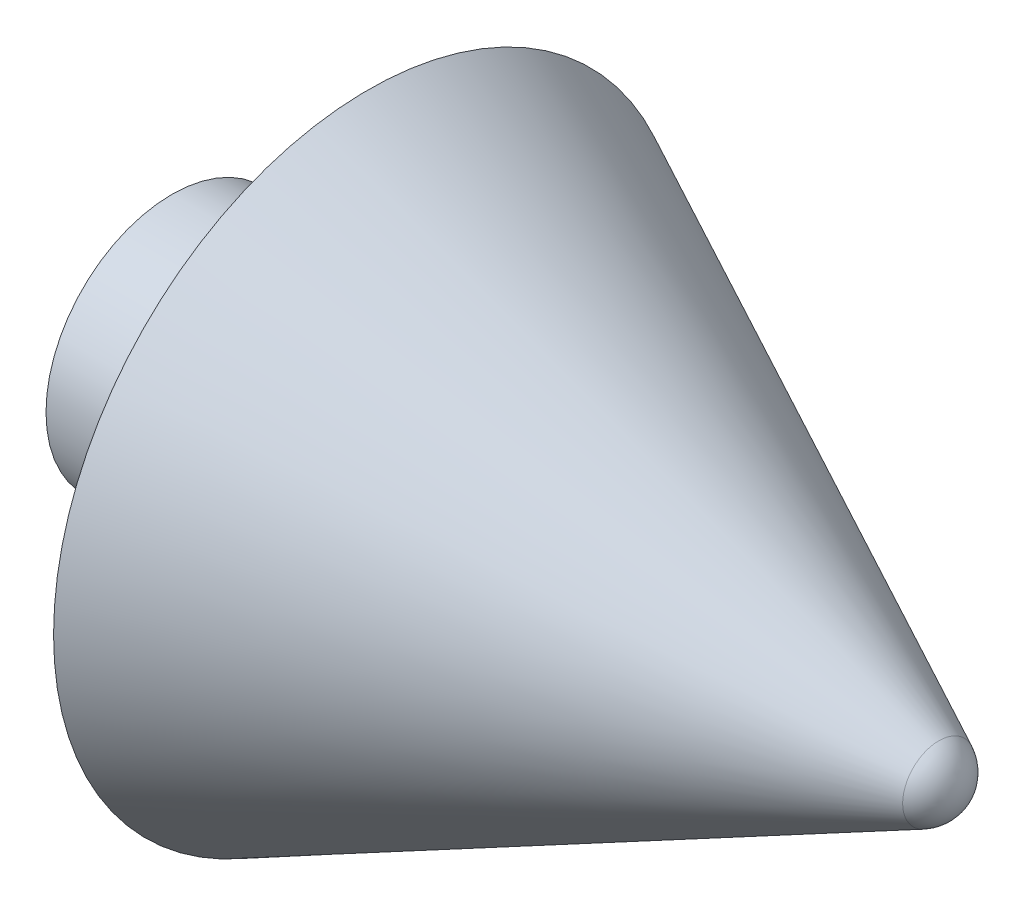
ISO-10303-21;
HEADER;
FILE_DESCRIPTION(('STEP AP214'),'2;1');
FILE_NAME('part.step','',(''),(''),'','','');
FILE_SCHEMA(('AUTOMOTIVE_DESIGN { 1 0 10303 214 1 1 1 1 }'));
ENDSEC;
DATA;
#1=APPLICATION_CONTEXT('core data for automotive mechanical design processes');
#2=APPLICATION_PROTOCOL_DEFINITION('international standard','automotive_design',2000,#1);
#3=PRODUCT_CONTEXT('',#1,'mechanical');
#4=PRODUCT('Part','Part','',(#3));
#5=PRODUCT_RELATED_PRODUCT_CATEGORY('part','',(#4));
#6=PRODUCT_DEFINITION_FORMATION('','',#4);
#7=PRODUCT_DEFINITION_CONTEXT('part definition',#1,'design');
#8=PRODUCT_DEFINITION('design','',#6,#7);
#9=PRODUCT_DEFINITION_SHAPE('','',#8);
#10=(LENGTH_UNIT() NAMED_UNIT(*) SI_UNIT(.MILLI.,.METRE.));
#11=(NAMED_UNIT(*) PLANE_ANGLE_UNIT() SI_UNIT($,.RADIAN.));
#12=(NAMED_UNIT(*) SI_UNIT($,.STERADIAN.) SOLID_ANGLE_UNIT());
#13=UNCERTAINTY_MEASURE_WITH_UNIT(LENGTH_MEASURE(1.E-05),#10,'distance_accuracy_value','');
#14=(GEOMETRIC_REPRESENTATION_CONTEXT(3) GLOBAL_UNCERTAINTY_ASSIGNED_CONTEXT((#13)) GLOBAL_UNIT_ASSIGNED_CONTEXT((#10,
#11,#12)) REPRESENTATION_CONTEXT('',''));
#15=CARTESIAN_POINT('',(0.,0.,0.));
#16=DIRECTION('',(0.,0.,1.));
#17=DIRECTION('',(1.,0.,0.));
#18=AXIS2_PLACEMENT_3D('',#15,#16,#17);
#19=CARTESIAN_POINT('',(18.9096159573078,0.,0.));
#20=DIRECTION('',(-1.,0.,0.));
#21=DIRECTION('',(0.,1.,0.));
#22=AXIS2_PLACEMENT_3D('',#19,#20,#21);
#23=SPHERICAL_SURFACE('',#22,1.016);
#24=CARTESIAN_POINT('',(19.3550010424455,0.,0.));
#25=DIRECTION('',(-1.,0.,0.));
#26=DIRECTION('',(0.,0.,1.));
#27=AXIS2_PLACEMENT_3D('',#24,#25,#26);
#28=CIRCLE('',#27,0.913174751039954);
#29=CARTESIAN_POINT('',(19.3550010424455,0.,0.913174751039933));
#30=VERTEX_POINT('',#29);
#31=EDGE_CURVE('E11',#30,#30,#28,.T.);
#32=ORIENTED_EDGE('',*,*,#31,.F.);
#33=EDGE_LOOP('',(#32));
#34=FACE_BOUND('',#33,.T.);
#35=ADVANCED_FACE('F38',(#34),#23,.T.);
#36=CARTESIAN_POINT('',(4.95299999999999,0.,0.));
#37=DIRECTION('',(-1.,0.,0.));
#38=DIRECTION('',(0.,0.,1.));
#39=AXIS2_PLACEMENT_3D('',#36,#37,#38);
#40=CONICAL_SURFACE('',#39,7.9375,0.453785605518519);
#41=CARTESIAN_POINT('',(4.95299999999999,0.,0.));
#42=DIRECTION('',(-1.,0.,0.));
#43=DIRECTION('',(0.,0.,1.));
#44=AXIS2_PLACEMENT_3D('',#41,#42,#43);
#45=CIRCLE('',#44,7.9375);
#46=CARTESIAN_POINT('',(4.95299999999999,0.,7.93749999999999));
#47=VERTEX_POINT('',#46);
#48=EDGE_CURVE('E44',#47,#47,#45,.T.);
#49=CARTESIAN_POINT('',(19.3550010424455,0.,0.913174751039933));
#50=CARTESIAN_POINT('',(19.2049801982533,0.,0.986344805716601));
#51=CARTESIAN_POINT('',(19.0549593540612,0.,1.05951486039327));
#52=CARTESIAN_POINT('',(18.7549176656769,0.,1.2058549697466));
#53=CARTESIAN_POINT('',(18.6048968214848,0.,1.27902502442327));
#54=CARTESIAN_POINT('',(18.3048551331005,0.,1.4253651337766));
#55=CARTESIAN_POINT('',(18.1548342889084,0.,1.49853518845327));
#56=CARTESIAN_POINT('',(17.8547926005241,0.,1.64487529780661));
#57=CARTESIAN_POINT('',(17.7047717563319,0.,1.71804535248327));
#58=CARTESIAN_POINT('',(17.4047300679476,0.,1.86438546183661));
#59=CARTESIAN_POINT('',(17.2547092237555,0.,1.93755551651328));
#60=CARTESIAN_POINT('',(16.9546675353712,0.,2.08389562586661));
#61=CARTESIAN_POINT('',(16.8046466911791,0.,2.15706568054328));
#62=CARTESIAN_POINT('',(16.5046050027948,0.,2.30340578989661));
#63=CARTESIAN_POINT('',(16.3545841586027,0.,2.37657584457328));
#64=CARTESIAN_POINT('',(16.0545424702184,0.,2.52291595392661));
#65=CARTESIAN_POINT('',(15.9045216260262,0.,2.59608600860328));
#66=CARTESIAN_POINT('',(15.604479937642,0.,2.74242611795662));
#67=CARTESIAN_POINT('',(15.4544590934498,0.,2.81559617263328));
#68=CARTESIAN_POINT('',(15.1544174050655,0.,2.96193628198662));
#69=CARTESIAN_POINT('',(15.0043965608734,0.,3.03510633666328));
#70=CARTESIAN_POINT('',(14.7043548724891,0.,3.18144644601662));
#71=CARTESIAN_POINT('',(14.554334028297,0.,3.25461650069329));
#72=CARTESIAN_POINT('',(14.2542923399127,0.,3.40095661004662));
#73=CARTESIAN_POINT('',(14.1042714957206,0.,3.47412666472329));
#74=CARTESIAN_POINT('',(13.8042298073363,0.,3.62046677407662));
#75=CARTESIAN_POINT('',(13.6542089631441,0.,3.69363682875329));
#76=CARTESIAN_POINT('',(13.3541672747599,0.,3.83997693810663));
#77=CARTESIAN_POINT('',(13.2041464305677,0.,3.91314699278329));
#78=CARTESIAN_POINT('',(12.9041047421834,0.,4.05948710213663));
#79=CARTESIAN_POINT('',(12.7540838979913,0.,4.13265715681329));
#80=CARTESIAN_POINT('',(12.454042209607,0.,4.27899726616663));
#81=CARTESIAN_POINT('',(12.3040213654149,0.,4.3521673208433));
#82=CARTESIAN_POINT('',(12.0039796770306,0.,4.49850743019663));
#83=CARTESIAN_POINT('',(11.8539588328385,0.,4.5716774848733));
#84=CARTESIAN_POINT('',(11.5539171444542,0.,4.71801759422663));
#85=CARTESIAN_POINT('',(11.403896300262,0.,4.7911876489033));
#86=CARTESIAN_POINT('',(11.1038546118777,0.,4.93752775825664));
#87=CARTESIAN_POINT('',(10.9538337676856,0.,5.0106978129333));
#88=CARTESIAN_POINT('',(10.6537920793013,0.,5.15703792228664));
#89=CARTESIAN_POINT('',(10.5037712351092,0.,5.2302079769633));
#90=CARTESIAN_POINT('',(10.2037295467249,0.,5.37654808631664));
#91=CARTESIAN_POINT('',(10.0537087025328,0.,5.44971814099331));
#92=CARTESIAN_POINT('',(9.75366701414848,0.,5.59605825034664));
#93=CARTESIAN_POINT('',(9.60364616995634,0.,5.66922830502331));
#94=CARTESIAN_POINT('',(9.30360448157206,0.,5.81556841437664));
#95=CARTESIAN_POINT('',(9.15358363737992,0.,5.88873846905331));
#96=CARTESIAN_POINT('',(8.85354194899564,0.,6.03507857840664));
#97=CARTESIAN_POINT('',(8.7035211048035,0.,6.10824863308331));
#98=CARTESIAN_POINT('',(8.40347941641922,0.,6.25458874243665));
#99=CARTESIAN_POINT('',(8.25345857222708,0.,6.32775879711332));
#100=CARTESIAN_POINT('',(7.9534168838428,0.,6.47409890646665));
#101=CARTESIAN_POINT('',(7.80339603965065,0.,6.54726896114332));
#102=CARTESIAN_POINT('',(7.50335435126637,0.,6.69360907049665));
#103=CARTESIAN_POINT('',(7.35333350707423,0.,6.76677912517332));
#104=CARTESIAN_POINT('',(7.05329181868995,0.,6.91311923452665));
#105=CARTESIAN_POINT('',(6.90327097449781,0.,6.98628928920332));
#106=CARTESIAN_POINT('',(6.60322928611353,0.,7.13262939855665));
#107=CARTESIAN_POINT('',(6.45320844192139,0.,7.20579945323332));
#108=CARTESIAN_POINT('',(6.15316675353711,0.,7.35213956258666));
#109=CARTESIAN_POINT('',(6.00314590934497,0.,7.42530961726332));
#110=CARTESIAN_POINT('',(5.70310422096069,0.,7.57164972661666));
#111=CARTESIAN_POINT('',(5.55308337676855,0.,7.64481978129333));
#112=CARTESIAN_POINT('',(5.25304168838427,0.,7.79115989064666));
#113=CARTESIAN_POINT('',(5.10302084419213,0.,7.86432994532333));
#114=CARTESIAN_POINT('',(4.95299999999999,0.,7.93749999999999));
#115=B_SPLINE_CURVE_WITH_KNOTS('',3,(#49,#50,#51,#52,#53,#54,#55,#56,#57,#58,#59,#60,#61,#62,
#63,#64,#65,#66,#67,#68,#69,#70,#71,#72,#73,#74,#75,#76,#77,#78,#79,#80,#81,#82,#83,#84,#85,#86,
#87,#88,#89,#90,#91,#92,#93,#94,#95,#96,#97,#98,#99,#100,#101,#102,#103,#104,#105,#106,#107,
#108,#109,#110,#111,#112,#113,#114),.UNSPECIFIED.,.F.,.F.,(4,2,2,2,2,2,2,2,2,2,2,2,2,2,2,2,2,2,
2,2,2,2,2,2,2,2,2,2,2,2,2,2,4),(0.,0.500740447079703,1.00148089415941,1.50222134123911,
2.00296178831881,2.50370223539851,3.00444268247822,3.50518312955792,4.00592357663762,
4.50666402371733,5.00740447079703,5.50814491787673,6.00888536495644,6.50962581203614,
7.01036625911584,7.51110670619555,8.01184715327525,8.51258760035495,9.01332804743466,
9.51406849451436,10.0148089415941,10.5155493886738,11.0162898357535,11.5170302828332,
12.0177707299129,12.5185111769926,13.0192516240723,13.519992071152,14.0207325182317,
14.5214729653114,15.0222134123911,15.5229538594708,16.0236943065505),.UNSPECIFIED.);
#116=EDGE_CURVE('BSEAM85',#30,#47,#115,.T.);
#117=ORIENTED_EDGE('',*,*,#31,.T.);
#118=ORIENTED_EDGE('',*,*,#48,.F.);
#119=ORIENTED_EDGE('',*,*,#116,.T.);
#120=ORIENTED_EDGE('',*,*,#116,.F.);
#121=EDGE_LOOP('',(#117,#119,#118,#120));
#122=FACE_BOUND('',#121,.T.);
#123=ADVANCED_FACE('F85',(#122),#40,.T.);
#124=CARTESIAN_POINT('',(4.95299999999999,0.,0.));
#125=DIRECTION('',(-1.,0.,0.));
#126=DIRECTION('',(0.,0.,1.));
#127=AXIS2_PLACEMENT_3D('',#124,#125,#126);
#128=PLANE('',#127);
#129=ORIENTED_EDGE('',*,*,#48,.T.);
#130=EDGE_LOOP('',(#129));
#131=FACE_BOUND('',#130,.T.);
#132=CARTESIAN_POINT('',(4.95299999999999,0.,0.));
#133=DIRECTION('',(-1.,0.,0.));
#134=DIRECTION('',(0.,0.,1.));
#135=AXIS2_PLACEMENT_3D('',#132,#133,#134);
#136=CIRCLE('',#135,6.2865);
#137=CARTESIAN_POINT('',(4.95299999999999,0.,6.28649999999999));
#138=VERTEX_POINT('',#137);
#139=EDGE_CURVE('E77',#138,#138,#136,.T.);
#140=ORIENTED_EDGE('',*,*,#139,.F.);
#141=EDGE_LOOP('',(#140));
#142=FACE_BOUND('',#141,.T.);
#143=ADVANCED_FACE('F82',(#131,#142),#128,.T.);
#144=CARTESIAN_POINT('',(4.95299999999999,0.,0.));
#145=DIRECTION('',(-1.,0.,0.));
#146=DIRECTION('',(0.,0.,1.));
#147=AXIS2_PLACEMENT_3D('',#144,#145,#146);
#148=TOROIDAL_SURFACE('',#147,5.5245,0.762);
#149=ORIENTED_EDGE('',*,*,#139,.T.);
#150=EDGE_LOOP('',(#149));
#151=FACE_BOUND('',#150,.T.);
#152=CARTESIAN_POINT('',(4.95299999999999,0.,0.));
#153=DIRECTION('',(-1.,0.,0.));
#154=DIRECTION('',(0.,0.,1.));
#155=AXIS2_PLACEMENT_3D('',#152,#153,#154);
#156=CIRCLE('',#155,4.7625);
#157=CARTESIAN_POINT('',(4.95299999999999,0.,4.76249999999999));
#158=VERTEX_POINT('',#157);
#159=EDGE_CURVE('E74',#158,#158,#156,.T.);
#160=ORIENTED_EDGE('',*,*,#159,.F.);
#161=EDGE_LOOP('',(#160));
#162=FACE_BOUND('',#161,.T.);
#163=ADVANCED_FACE('F92',(#151,#162),#148,.F.);
#164=CARTESIAN_POINT('',(-1.46723612101529,0.,0.));
#165=DIRECTION('',(-1.,0.,0.));
#166=DIRECTION('',(0.,0.,1.));
#167=AXIS2_PLACEMENT_3D('',#164,#165,#166);
#168=CYLINDRICAL_SURFACE('',#167,4.7625);
#169=ORIENTED_EDGE('',*,*,#159,.T.);
#170=EDGE_LOOP('',(#169));
#171=FACE_BOUND('',#170,.T.);
#172=CARTESIAN_POINT('',(3.17500000000004,0.,0.));
#173=DIRECTION('',(-1.,0.,0.));
#174=DIRECTION('',(0.,0.,1.));
#175=AXIS2_PLACEMENT_3D('',#172,#173,#174);
#176=CIRCLE('',#175,4.7625);
#177=CARTESIAN_POINT('',(3.17500000000004,0.,4.76249999999999));
#178=VERTEX_POINT('',#177);
#179=EDGE_CURVE('E71',#178,#178,#176,.T.);
#180=ORIENTED_EDGE('',*,*,#179,.F.);
#181=EDGE_LOOP('',(#180));
#182=FACE_BOUND('',#181,.T.);
#183=ADVANCED_FACE('F98',(#171,#182),#168,.T.);
#184=CARTESIAN_POINT('',(3.17500000000004,0.,0.));
#185=DIRECTION('',(1.,0.,0.));
#186=DIRECTION('',(0.,0.,-1.));
#187=AXIS2_PLACEMENT_3D('',#184,#185,#186);
#188=PLANE('',#187);
#189=CARTESIAN_POINT('',(3.17500000000004,0.,0.));
#190=DIRECTION('',(-1.,0.,0.));
#191=DIRECTION('',(0.,0.,1.));
#192=AXIS2_PLACEMENT_3D('',#189,#190,#191);
#193=CIRCLE('',#192,3.175);
#194=CARTESIAN_POINT('',(3.17500000000004,0.,3.175));
#195=VERTEX_POINT('',#194);
#196=EDGE_CURVE('E68',#195,#195,#193,.T.);
#197=ORIENTED_EDGE('',*,*,#196,.F.);
#198=EDGE_LOOP('',(#197));
#199=FACE_BOUND('',#198,.T.);
#200=ORIENTED_EDGE('',*,*,#179,.T.);
#201=EDGE_LOOP('',(#200));
#202=FACE_BOUND('',#201,.T.);
#203=ADVANCED_FACE('F102',(#199,#202),#188,.F.);
#204=CARTESIAN_POINT('',(2.413,0.,0.));
#205=DIRECTION('',(-1.,0.,0.));
#206=DIRECTION('',(0.,0.,1.));
#207=AXIS2_PLACEMENT_3D('',#204,#205,#206);
#208=TOROIDAL_SURFACE('',#207,3.175,0.762);
#209=CARTESIAN_POINT('',(1.65099999999996,0.,0.));
#210=DIRECTION('',(-1.,0.,0.));
#211=DIRECTION('',(0.,0.,1.));
#212=AXIS2_PLACEMENT_3D('',#209,#210,#211);
#213=CIRCLE('',#212,3.175);
#214=CARTESIAN_POINT('',(1.65099999999996,0.,3.175));
#215=VERTEX_POINT('',#214);
#216=EDGE_CURVE('E61',#215,#215,#213,.T.);
#217=ORIENTED_EDGE('',*,*,#216,.F.);
#218=EDGE_LOOP('',(#217));
#219=FACE_BOUND('',#218,.T.);
#220=ORIENTED_EDGE('',*,*,#196,.T.);
#221=EDGE_LOOP('',(#220));
#222=FACE_BOUND('',#221,.T.);
#223=ADVANCED_FACE('F106',(#219,#222),#208,.F.);
#224=CARTESIAN_POINT('',(-1.46723612101529,0.,0.));
#225=DIRECTION('',(-1.,0.,0.));
#226=DIRECTION('',(0.,0.,1.));
#227=AXIS2_PLACEMENT_3D('',#224,#225,#226);
#228=CYLINDRICAL_SURFACE('',#227,3.175);
#229=CARTESIAN_POINT('',(0.,0.,0.));
#230=DIRECTION('',(-1.,0.,0.));
#231=DIRECTION('',(0.,0.,1.));
#232=AXIS2_PLACEMENT_3D('',#229,#230,#231);
#233=CIRCLE('',#232,3.175);
#234=CARTESIAN_POINT('',(0.,0.,3.175));
#235=VERTEX_POINT('',#234);
#236=EDGE_CURVE('E57',#235,#235,#233,.T.);
#237=ORIENTED_EDGE('',*,*,#236,.F.);
#238=EDGE_LOOP('',(#237));
#239=FACE_BOUND('',#238,.T.);
#240=ORIENTED_EDGE('',*,*,#216,.T.);
#241=EDGE_LOOP('',(#240));
#242=FACE_BOUND('',#241,.T.);
#243=ADVANCED_FACE('F110',(#239,#242),#228,.T.);
#244=CARTESIAN_POINT('',(0.,0.,0.));
#245=DIRECTION('',(-1.,0.,0.));
#246=DIRECTION('',(0.,0.,1.));
#247=AXIS2_PLACEMENT_3D('',#244,#245,#246);
#248=PLANE('',#247);
#249=CARTESIAN_POINT('',(0.,0.,0.));
#250=DIRECTION('',(-1.,0.,0.));
#251=DIRECTION('',(0.,0.,1.));
#252=AXIS2_PLACEMENT_3D('',#249,#250,#251);
#253=CIRCLE('',#252,1.7272);
#254=CARTESIAN_POINT('',(0.,0.,1.7272));
#255=VERTEX_POINT('',#254);
#256=EDGE_CURVE('E58',#255,#255,#253,.T.);
#257=ORIENTED_EDGE('',*,*,#256,.F.);
#258=EDGE_LOOP('',(#257));
#259=FACE_BOUND('',#258,.T.);
#260=ORIENTED_EDGE('',*,*,#236,.T.);
#261=EDGE_LOOP('',(#260));
#262=FACE_BOUND('',#261,.T.);
#263=ADVANCED_FACE('F51',(#259,#262),#248,.T.);
#264=CARTESIAN_POINT('',(11.4300000000001,0.,0.));
#265=DIRECTION('',(-1.,0.,0.));
#266=DIRECTION('',(0.,0.,1.));
#267=AXIS2_PLACEMENT_3D('',#264,#265,#266);
#268=CONICAL_SURFACE('',#267,1.7272,1.02974425867665);
#269=CARTESIAN_POINT('',(12.4678064611844,0.,0.));
#270=VERTEX_POINT('',#269);
#271=VERTEX_LOOP('',#270);
#272=FACE_BOUND('',#271,.T.);
#273=CARTESIAN_POINT('',(11.4300000000001,0.,0.));
#274=DIRECTION('',(-1.,0.,0.));
#275=DIRECTION('',(0.,0.,1.));
#276=AXIS2_PLACEMENT_3D('',#273,#274,#275);
#277=CIRCLE('',#276,1.7272);
#278=CARTESIAN_POINT('',(11.4300000000001,0.,1.7272));
#279=VERTEX_POINT('',#278);
#280=EDGE_CURVE('E55',#279,#279,#277,.T.);
#281=ORIENTED_EDGE('',*,*,#280,.T.);
#282=EDGE_LOOP('',(#281));
#283=FACE_BOUND('',#282,.T.);
#284=ADVANCED_FACE('F47',(#272,#283),#268,.F.);
#285=CARTESIAN_POINT('',(0.,0.,0.));
#286=DIRECTION('',(-1.,0.,0.));
#287=DIRECTION('',(0.,0.,1.));
#288=AXIS2_PLACEMENT_3D('',#285,#286,#287);
#289=CYLINDRICAL_SURFACE('',#288,1.7272);
#290=ORIENTED_EDGE('',*,*,#280,.F.);
#291=EDGE_LOOP('',(#290));
#292=FACE_BOUND('',#291,.T.);
#293=ORIENTED_EDGE('',*,*,#256,.T.);
#294=EDGE_LOOP('',(#293));
#295=FACE_BOUND('',#294,.T.);
#296=ADVANCED_FACE('F50',(#292,#295),#289,.F.);
#297=CLOSED_SHELL('',(#35,#123,#143,#163,#183,#203,#223,#243,#263,#284,#296));
#298=MANIFOLD_SOLID_BREP('B2',#297);
#299=ADVANCED_BREP_SHAPE_REPRESENTATION('',(#18,#298),#14);
#300=SHAPE_DEFINITION_REPRESENTATION(#9,#299);
ENDSEC;
END-ISO-10303-21;
